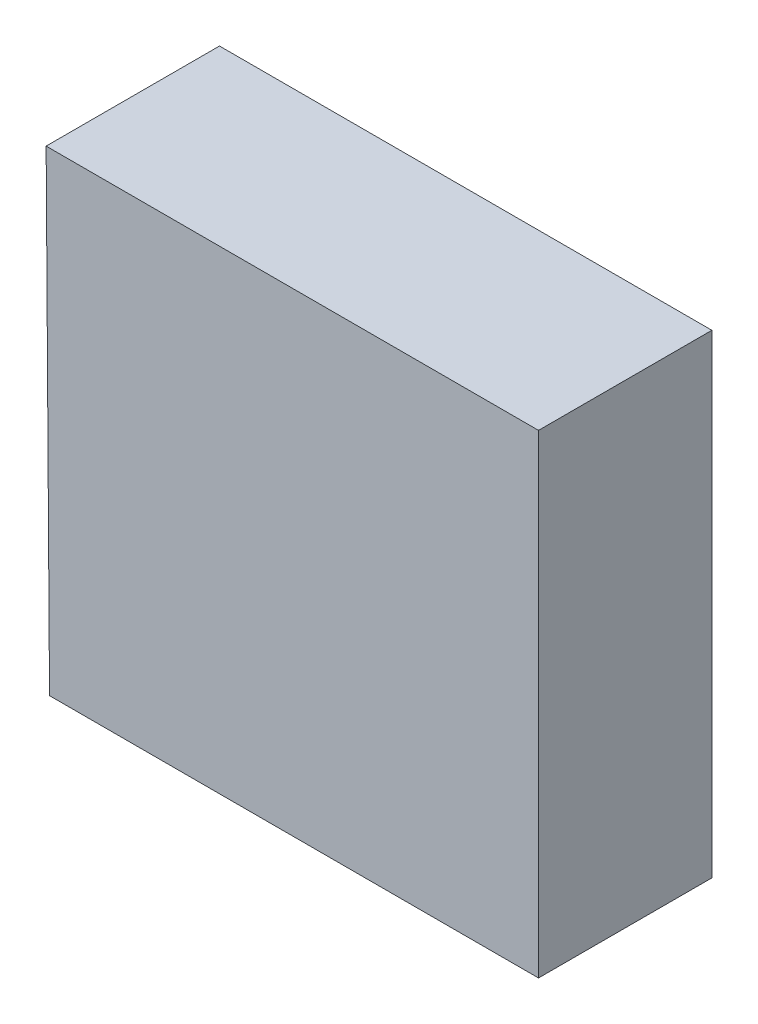
ISO-10303-21;
HEADER;
FILE_DESCRIPTION(('STEP AP214'),'2;1');
FILE_NAME('part.step','',(''),(''),'','','');
FILE_SCHEMA(('AUTOMOTIVE_DESIGN { 1 0 10303 214 1 1 1 1 }'));
ENDSEC;
DATA;
#1=APPLICATION_CONTEXT('core data for automotive mechanical design processes');
#2=APPLICATION_PROTOCOL_DEFINITION('international standard','automotive_design',2000,#1);
#3=PRODUCT_CONTEXT('',#1,'mechanical');
#4=PRODUCT('Part','Part','',(#3));
#5=PRODUCT_RELATED_PRODUCT_CATEGORY('part','',(#4));
#6=PRODUCT_DEFINITION_FORMATION('','',#4);
#7=PRODUCT_DEFINITION_CONTEXT('part definition',#1,'design');
#8=PRODUCT_DEFINITION('design','',#6,#7);
#9=PRODUCT_DEFINITION_SHAPE('','',#8);
#10=(LENGTH_UNIT() NAMED_UNIT(*) SI_UNIT(.MILLI.,.METRE.));
#11=(NAMED_UNIT(*) PLANE_ANGLE_UNIT() SI_UNIT($,.RADIAN.));
#12=(NAMED_UNIT(*) SI_UNIT($,.STERADIAN.) SOLID_ANGLE_UNIT());
#13=UNCERTAINTY_MEASURE_WITH_UNIT(LENGTH_MEASURE(1.E-05),#10,'distance_accuracy_value','');
#14=(GEOMETRIC_REPRESENTATION_CONTEXT(3) GLOBAL_UNCERTAINTY_ASSIGNED_CONTEXT((#13)) GLOBAL_UNIT_ASSIGNED_CONTEXT((#10,
#11,#12)) REPRESENTATION_CONTEXT('',''));
#15=CARTESIAN_POINT('',(0.,0.,0.));
#16=DIRECTION('',(0.,0.,1.));
#17=DIRECTION('',(1.,0.,0.));
#18=AXIS2_PLACEMENT_3D('',#15,#16,#17);
#19=CARTESIAN_POINT('',(-2.8702,5.3086,3.89001));
#20=DIRECTION('',(0.,-1.,0.));
#21=DIRECTION('',(0.,0.,-1.));
#22=AXIS2_PLACEMENT_3D('',#19,#20,#21);
#23=PLANE('',#22);
#24=DIRECTION('',(-1.,0.,0.));
#25=VECTOR('',#24,1.);
#26=CARTESIAN_POINT('',(-2.8702,5.3086,0.));
#27=LINE('',#26,#25);
#28=CARTESIAN_POINT('',(8.1788,5.3086,0.));
#29=VERTEX_POINT('',#28);
#30=CARTESIAN_POINT('',(-2.8702,5.3086,0.));
#31=VERTEX_POINT('',#30);
#32=EDGE_CURVE('E95',#29,#31,#27,.T.);
#33=ORIENTED_EDGE('',*,*,#32,.T.);
#34=DIRECTION('',(0.,0.,-1.));
#35=VECTOR('',#34,1.);
#36=CARTESIAN_POINT('',(-2.8702,5.3086,3.89001));
#37=LINE('',#36,#35);
#38=CARTESIAN_POINT('',(-2.8702,5.3086,3.89001));
#39=VERTEX_POINT('',#38);
#40=EDGE_CURVE('E11',#39,#31,#37,.T.);
#41=ORIENTED_EDGE('',*,*,#40,.F.);
#42=DIRECTION('',(-1.,0.,0.));
#43=VECTOR('',#42,1.);
#44=CARTESIAN_POINT('',(-2.8702,5.3086,3.89001));
#45=LINE('',#44,#43);
#46=CARTESIAN_POINT('',(8.1788,5.3086,3.89001));
#47=VERTEX_POINT('',#46);
#48=EDGE_CURVE('E83',#47,#39,#45,.T.);
#49=ORIENTED_EDGE('',*,*,#48,.F.);
#50=DIRECTION('',(0.,0.,-1.));
#51=VECTOR('',#50,1.);
#52=CARTESIAN_POINT('',(8.1788,5.3086,3.89001));
#53=LINE('',#52,#51);
#54=EDGE_CURVE('E91',#47,#29,#53,.T.);
#55=ORIENTED_EDGE('',*,*,#54,.T.);
#56=EDGE_LOOP('',(#33,#41,#49,#55));
#57=FACE_BOUND('',#56,.T.);
#58=ADVANCED_FACE('F32',(#57),#23,.F.);
#59=CARTESIAN_POINT('',(-2.794,-5.334,3.89001));
#60=DIRECTION('',(0.999974368868994,0.00715972101815511,0.));
#61=DIRECTION('',(-0.00715972101815511,0.999974368868994,0.));
#62=AXIS2_PLACEMENT_3D('',#59,#60,#61);
#63=PLANE('',#62);
#64=DIRECTION('',(0.00715972101815511,-0.999974368868994,0.));
#65=VECTOR('',#64,1.);
#66=CARTESIAN_POINT('',(-2.794,-5.334,0.));
#67=LINE('',#66,#65);
#68=CARTESIAN_POINT('',(-2.794,-5.334,0.));
#69=VERTEX_POINT('',#68);
#70=EDGE_CURVE('E87',#31,#69,#67,.T.);
#71=ORIENTED_EDGE('',*,*,#70,.T.);
#72=DIRECTION('',(0.,0.,-1.));
#73=VECTOR('',#72,1.);
#74=CARTESIAN_POINT('',(-2.794,-5.334,3.89001));
#75=LINE('',#74,#73);
#76=CARTESIAN_POINT('',(-2.794,-5.334,3.89001));
#77=VERTEX_POINT('',#76);
#78=EDGE_CURVE('E40',#77,#69,#75,.T.);
#79=ORIENTED_EDGE('',*,*,#78,.F.);
#80=DIRECTION('',(0.00715972101815511,-0.999974368868994,0.));
#81=VECTOR('',#80,1.);
#82=CARTESIAN_POINT('',(-2.794,-5.334,3.89001));
#83=LINE('',#82,#81);
#84=EDGE_CURVE('E78',#39,#77,#83,.T.);
#85=ORIENTED_EDGE('',*,*,#84,.F.);
#86=ORIENTED_EDGE('',*,*,#40,.T.);
#87=EDGE_LOOP('',(#71,#79,#85,#86));
#88=FACE_BOUND('',#87,.T.);
#89=ADVANCED_FACE('F86',(#88),#63,.F.);
#90=CARTESIAN_POINT('',(8.1788,-5.334,3.89001));
#91=DIRECTION('',(0.,1.,0.));
#92=DIRECTION('',(0.,0.,1.));
#93=AXIS2_PLACEMENT_3D('',#90,#91,#92);
#94=PLANE('',#93);
#95=DIRECTION('',(1.,0.,0.));
#96=VECTOR('',#95,1.);
#97=CARTESIAN_POINT('',(8.1788,-5.334,0.));
#98=LINE('',#97,#96);
#99=CARTESIAN_POINT('',(8.1788,-5.334,0.));
#100=VERTEX_POINT('',#99);
#101=EDGE_CURVE('E65',#69,#100,#98,.T.);
#102=ORIENTED_EDGE('',*,*,#101,.T.);
#103=DIRECTION('',(0.,0.,-1.));
#104=VECTOR('',#103,1.);
#105=CARTESIAN_POINT('',(8.1788,-5.334,3.89001));
#106=LINE('',#105,#104);
#107=CARTESIAN_POINT('',(8.1788,-5.334,3.89001));
#108=VERTEX_POINT('',#107);
#109=EDGE_CURVE('E88',#108,#100,#106,.T.);
#110=ORIENTED_EDGE('',*,*,#109,.F.);
#111=DIRECTION('',(1.,0.,0.));
#112=VECTOR('',#111,1.);
#113=CARTESIAN_POINT('',(8.1788,-5.334,3.89001));
#114=LINE('',#113,#112);
#115=EDGE_CURVE('E81',#77,#108,#114,.T.);
#116=ORIENTED_EDGE('',*,*,#115,.F.);
#117=ORIENTED_EDGE('',*,*,#78,.T.);
#118=EDGE_LOOP('',(#102,#110,#116,#117));
#119=FACE_BOUND('',#118,.T.);
#120=ADVANCED_FACE('F89',(#119),#94,.F.);
#121=CARTESIAN_POINT('',(8.1788,5.3086,3.89001));
#122=DIRECTION('',(-1.,0.,0.));
#123=DIRECTION('',(0.,0.,1.));
#124=AXIS2_PLACEMENT_3D('',#121,#122,#123);
#125=PLANE('',#124);
#126=DIRECTION('',(0.,1.,0.));
#127=VECTOR('',#126,1.);
#128=CARTESIAN_POINT('',(8.1788,5.3086,0.));
#129=LINE('',#128,#127);
#130=EDGE_CURVE('E71',#100,#29,#129,.T.);
#131=ORIENTED_EDGE('',*,*,#130,.T.);
#132=ORIENTED_EDGE('',*,*,#54,.F.);
#133=DIRECTION('',(0.,1.,0.));
#134=VECTOR('',#133,1.);
#135=CARTESIAN_POINT('',(8.1788,5.3086,3.89001));
#136=LINE('',#135,#134);
#137=EDGE_CURVE('E48',#108,#47,#136,.T.);
#138=ORIENTED_EDGE('',*,*,#137,.F.);
#139=ORIENTED_EDGE('',*,*,#109,.T.);
#140=EDGE_LOOP('',(#131,#132,#138,#139));
#141=FACE_BOUND('',#140,.T.);
#142=ADVANCED_FACE('F102',(#141),#125,.F.);
#143=CARTESIAN_POINT('',(0.,0.,3.89001));
#144=DIRECTION('',(0.,0.,-1.));
#145=DIRECTION('',(-1.,0.,0.));
#146=AXIS2_PLACEMENT_3D('',#143,#144,#145);
#147=PLANE('',#146);
#148=ORIENTED_EDGE('',*,*,#48,.T.);
#149=ORIENTED_EDGE('',*,*,#84,.T.);
#150=ORIENTED_EDGE('',*,*,#115,.T.);
#151=ORIENTED_EDGE('',*,*,#137,.T.);
#152=EDGE_LOOP('',(#148,#149,#150,#151));
#153=FACE_BOUND('',#152,.T.);
#154=ADVANCED_FACE('F79',(#153),#147,.F.);
#155=CARTESIAN_POINT('',(0.,0.,0.));
#156=DIRECTION('',(0.,0.,-1.));
#157=DIRECTION('',(-1.,0.,0.));
#158=AXIS2_PLACEMENT_3D('',#155,#156,#157);
#159=PLANE('',#158);
#160=ORIENTED_EDGE('',*,*,#32,.F.);
#161=ORIENTED_EDGE('',*,*,#130,.F.);
#162=ORIENTED_EDGE('',*,*,#101,.F.);
#163=ORIENTED_EDGE('',*,*,#70,.F.);
#164=EDGE_LOOP('',(#160,#161,#162,#163));
#165=FACE_BOUND('',#164,.T.);
#166=ADVANCED_FACE('F105',(#165),#159,.T.);
#167=CLOSED_SHELL('',(#58,#89,#120,#142,#154,#166));
#168=MANIFOLD_SOLID_BREP('B2',#167);
#169=ADVANCED_BREP_SHAPE_REPRESENTATION('',(#18,#168),#14);
#170=SHAPE_DEFINITION_REPRESENTATION(#9,#169);
ENDSEC;
END-ISO-10303-21;
